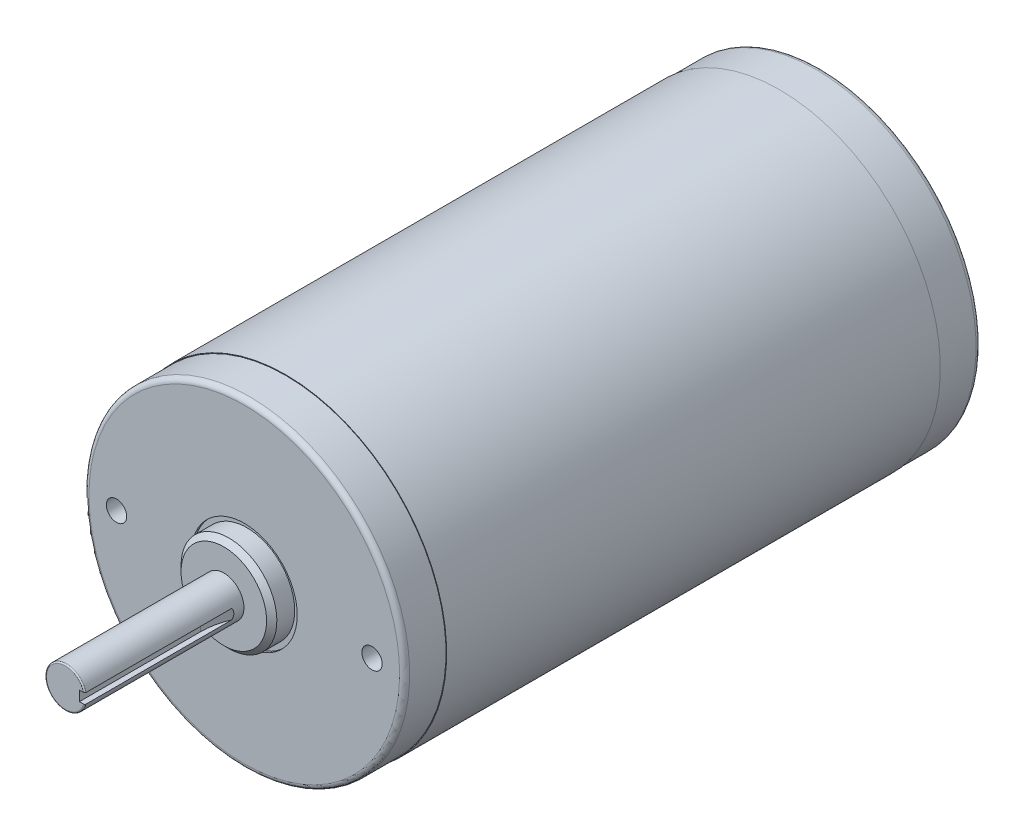
ISO-10303-21;
HEADER;
FILE_DESCRIPTION(('STEP AP214'),'2;1');
FILE_NAME('part.step','',(''),(''),'','','');
FILE_SCHEMA(('AUTOMOTIVE_DESIGN { 1 0 10303 214 1 1 1 1 }'));
ENDSEC;
DATA;
#1=APPLICATION_CONTEXT('core data for automotive mechanical design processes');
#2=APPLICATION_PROTOCOL_DEFINITION('international standard','automotive_design',2000,#1);
#3=PRODUCT_CONTEXT('',#1,'mechanical');
#4=PRODUCT('Part','Part','',(#3));
#5=PRODUCT_RELATED_PRODUCT_CATEGORY('part','',(#4));
#6=PRODUCT_DEFINITION_FORMATION('','',#4);
#7=PRODUCT_DEFINITION_CONTEXT('part definition',#1,'design');
#8=PRODUCT_DEFINITION('design','',#6,#7);
#9=PRODUCT_DEFINITION_SHAPE('','',#8);
#10=(LENGTH_UNIT() NAMED_UNIT(*) SI_UNIT(.MILLI.,.METRE.));
#11=(NAMED_UNIT(*) PLANE_ANGLE_UNIT() SI_UNIT($,.RADIAN.));
#12=(NAMED_UNIT(*) SI_UNIT($,.STERADIAN.) SOLID_ANGLE_UNIT());
#13=UNCERTAINTY_MEASURE_WITH_UNIT(LENGTH_MEASURE(1.E-05),#10,'distance_accuracy_value','');
#14=(GEOMETRIC_REPRESENTATION_CONTEXT(3) GLOBAL_UNCERTAINTY_ASSIGNED_CONTEXT((#13)) GLOBAL_UNIT_ASSIGNED_CONTEXT((#10,
#11,#12)) REPRESENTATION_CONTEXT('',''));
#15=CARTESIAN_POINT('',(0.,0.,0.));
#16=DIRECTION('',(0.,0.,1.));
#17=DIRECTION('',(1.,0.,0.));
#18=AXIS2_PLACEMENT_3D('',#15,#16,#17);
#19=CARTESIAN_POINT('',(35.56,109.2962,54.614));
#20=DIRECTION('',(0.,0.,1.));
#21=DIRECTION('',(0.,-1.,0.));
#22=AXIS2_PLACEMENT_3D('',#19,#20,#21);
#23=PLANE('',#22);
#24=DIRECTION('',(1.,0.,0.));
#25=VECTOR('',#24,1.);
#26=CARTESIAN_POINT('',(51.06,108.2962,54.614));
#27=LINE('',#26,#25);
#28=CARTESIAN_POINT('',(39.1700576172688,108.2962,54.614));
#29=VERTEX_POINT('',#28);
#30=CARTESIAN_POINT('',(38.36,108.2962,54.614));
#31=VERTEX_POINT('',#30);
#32=EDGE_CURVE('E83',#29,#31,#27,.F.);
#33=ORIENTED_EDGE('',*,*,#32,.T.);
#34=DIRECTION('',(0.,-1.,0.));
#35=VECTOR('',#34,1.);
#36=CARTESIAN_POINT('',(38.36,110.2962,54.614));
#37=LINE('',#36,#35);
#38=CARTESIAN_POINT('',(38.36,110.2962,54.614));
#39=VERTEX_POINT('',#38);
#40=EDGE_CURVE('E603',#31,#39,#37,.F.);
#41=ORIENTED_EDGE('',*,*,#40,.T.);
#42=DIRECTION('',(1.,0.,0.));
#43=VECTOR('',#42,1.);
#44=CARTESIAN_POINT('',(35.56,110.2962,54.614));
#45=LINE('',#44,#43);
#46=CARTESIAN_POINT('',(39.1700576172688,110.2962,54.614));
#47=VERTEX_POINT('',#46);
#48=EDGE_CURVE('E609',#39,#47,#45,.T.);
#49=ORIENTED_EDGE('',*,*,#48,.T.);
#50=CARTESIAN_POINT('',(35.56,109.2962,54.614));
#51=DIRECTION('',(0.,0.,-1.));
#52=DIRECTION('',(0.963709988592829,-0.266951414842494,0.));
#53=AXIS2_PLACEMENT_3D('',#50,#51,#52);
#54=CIRCLE('',#53,3.74600000000007);
#55=EDGE_CURVE('E85',#29,#47,#54,.T.);
#56=ORIENTED_EDGE('',*,*,#55,.F.);
#57=EDGE_LOOP('',(#33,#41,#49,#56));
#58=FACE_BOUND('',#57,.T.);
#59=ADVANCED_FACE('F17',(#58),#23,.T.);
#60=CARTESIAN_POINT('',(38.36,110.2962,54.614));
#61=DIRECTION('',(-1.,0.,0.));
#62=DIRECTION('',(0.,-1.,0.));
#63=AXIS2_PLACEMENT_3D('',#60,#61,#62);
#64=PLANE('',#63);
#65=DIRECTION('',(0.,1.,0.));
#66=VECTOR('',#65,1.);
#67=CARTESIAN_POINT('',(38.3600000000007,110.2962,30.5028774341236));
#68=LINE('',#67,#66);
#69=CARTESIAN_POINT('',(38.3600000000004,108.2962,30.5028774341239));
#70=VERTEX_POINT('',#69);
#71=CARTESIAN_POINT('',(38.3600000000004,110.2962,30.5028774341239));
#72=VERTEX_POINT('',#71);
#73=EDGE_CURVE('E100',#70,#72,#68,.T.);
#74=ORIENTED_EDGE('',*,*,#73,.T.);
#75=DIRECTION('',(0.,0.,1.));
#76=VECTOR('',#75,1.);
#77=CARTESIAN_POINT('',(38.36,110.2962,30.5028774341242));
#78=LINE('',#77,#76);
#79=EDGE_CURVE('E105',#39,#72,#78,.F.);
#80=ORIENTED_EDGE('',*,*,#79,.F.);
#81=ORIENTED_EDGE('',*,*,#40,.F.);
#82=DIRECTION('',(0.,0.,1.));
#83=VECTOR('',#82,1.);
#84=CARTESIAN_POINT('',(38.36,108.2962,30.5028774341234));
#85=LINE('',#84,#83);
#86=EDGE_CURVE('E606',#31,#70,#85,.F.);
#87=ORIENTED_EDGE('',*,*,#86,.T.);
#88=EDGE_LOOP('',(#74,#80,#81,#87));
#89=FACE_BOUND('',#88,.T.);
#90=ADVANCED_FACE('F588',(#89),#64,.F.);
#91=CARTESIAN_POINT('',(51.06,108.2962,30.5028774341234));
#92=DIRECTION('',(0.,-1.,0.));
#93=DIRECTION('',(1.,0.,0.));
#94=AXIS2_PLACEMENT_3D('',#91,#92,#93);
#95=PLANE('',#94);
#96=CARTESIAN_POINT('',(39.4329833462075,108.2962,54.36));
#97=CARTESIAN_POINT('',(39.4329972302194,108.2962,54.3739555925539));
#98=CARTESIAN_POINT('',(39.4317963848783,108.2962,54.387905050171));
#99=CARTESIAN_POINT('',(39.4270706819027,108.2962,54.4153819522983));
#100=CARTESIAN_POINT('',(39.4235496437534,108.2962,54.4289100521796));
#101=CARTESIAN_POINT('',(39.4142875070865,108.2962,54.4551853282689));
#102=CARTESIAN_POINT('',(39.4085459927767,108.2962,54.4679323577005));
#103=CARTESIAN_POINT('',(39.3950323448073,108.2962,54.4922988412567));
#104=CARTESIAN_POINT('',(39.3872600824922,108.2962,54.5039182238766));
#105=CARTESIAN_POINT('',(39.3698096556218,108.2962,54.5258734762801));
#106=CARTESIAN_POINT('',(39.3601078912621,108.2962,54.5361905694883));
#107=CARTESIAN_POINT('',(39.3391541322935,108.2962,54.5551089394723));
#108=CARTESIAN_POINT('',(39.3279017708629,108.2962,54.5637098090623));
#109=CARTESIAN_POINT('',(39.3038057604817,108.2962,54.5792300533628));
#110=CARTESIAN_POINT('',(39.2909241824277,108.2962,54.5860904762996));
#111=CARTESIAN_POINT('',(39.2642176606051,108.2962,54.5976268733184));
#112=CARTESIAN_POINT('',(39.2503927849253,108.2962,54.6023030048755));
#113=CARTESIAN_POINT('',(39.2254631214693,108.2962,54.6085530156468));
#114=CARTESIAN_POINT('',(39.2144729871068,108.2962,54.6105953325383));
#115=CARTESIAN_POINT('',(39.1923419471974,108.2962,54.6133188375813));
#116=CARTESIAN_POINT('',(39.1812012915638,108.2962,54.6140020556655));
#117=CARTESIAN_POINT('',(39.1700576172688,108.2962,54.614));
#118=B_SPLINE_CURVE_WITH_KNOTS('',3,(#96,#97,#98,#99,#100,#101,#102,#103,#104,#105,#106,#107,
#108,#109,#110,#111,#112,#113,#114,#115,#116,#117),.UNSPECIFIED.,.F.,.F.,(4,2,2,2,2,2,2,2,2,2,
4),(0.,0.0418059388647966,0.0835432284377074,0.125288337258225,0.167036091434435,
0.209329914368102,0.251633759901483,0.295221449388893,0.338805995964188,0.372260040088268,
0.405664080047949),.UNSPECIFIED.);
#119=CARTESIAN_POINT('',(39.4329833462075,108.2962,54.36));
#120=VERTEX_POINT('',#119);
#121=EDGE_CURVE('E75',#120,#29,#118,.T.);
#122=ORIENTED_EDGE('',*,*,#121,.F.);
#123=DIRECTION('',(0.,0.,1.));
#124=VECTOR('',#123,1.);
#125=CARTESIAN_POINT('',(39.4329833462075,108.2962,19.05));
#126=LINE('',#125,#124);
#127=CARTESIAN_POINT('',(39.4329833462075,108.2962,25.3938184471467));
#128=VERTEX_POINT('',#127);
#129=EDGE_CURVE('E79',#128,#120,#126,.T.);
#130=ORIENTED_EDGE('',*,*,#129,.F.);
#131=CARTESIAN_POINT('',(51.0600000000007,108.2962,30.5028774341242));
#132=DIRECTION('',(0.,1.,0.));
#133=DIRECTION('',(0.,0.,1.));
#134=AXIS2_PLACEMENT_3D('',#131,#132,#133);
#135=CIRCLE('',#134,12.7);
#136=EDGE_CURVE('E108',#128,#70,#135,.T.);
#137=ORIENTED_EDGE('',*,*,#136,.T.);
#138=ORIENTED_EDGE('',*,*,#86,.F.);
#139=ORIENTED_EDGE('',*,*,#32,.F.);
#140=EDGE_LOOP('',(#122,#130,#137,#138,#139));
#141=FACE_BOUND('',#140,.T.);
#142=ADVANCED_FACE('F76',(#141),#95,.F.);
#143=CARTESIAN_POINT('',(35.56,109.2962,54.36));
#144=DIRECTION('',(0.,0.,1.));
#145=DIRECTION('',(0.,-1.,0.));
#146=AXIS2_PLACEMENT_3D('',#143,#144,#145);
#147=TOROIDAL_SURFACE('',#146,3.74600000000008,0.254);
#148=CARTESIAN_POINT('',(39.4329833462075,110.2962,54.36));
#149=CARTESIAN_POINT('',(39.4329972302194,110.2962,54.3739555925539));
#150=CARTESIAN_POINT('',(39.4317963848783,110.2962,54.387905050171));
#151=CARTESIAN_POINT('',(39.4270706819027,110.2962,54.4153819522983));
#152=CARTESIAN_POINT('',(39.4235496437534,110.2962,54.4289100521796));
#153=CARTESIAN_POINT('',(39.4142875070865,110.2962,54.4551853282689));
#154=CARTESIAN_POINT('',(39.4085459927767,110.2962,54.4679323577005));
#155=CARTESIAN_POINT('',(39.3950323448073,110.2962,54.4922988412567));
#156=CARTESIAN_POINT('',(39.3872600824921,110.2962,54.5039182238766));
#157=CARTESIAN_POINT('',(39.3698096556218,110.2962,54.5258734762801));
#158=CARTESIAN_POINT('',(39.3601078912621,110.2962,54.5361905694883));
#159=CARTESIAN_POINT('',(39.3391541322935,110.2962,54.5551089394723));
#160=CARTESIAN_POINT('',(39.3279017708629,110.2962,54.5637098090622));
#161=CARTESIAN_POINT('',(39.3038057604817,110.2962,54.5792300533628));
#162=CARTESIAN_POINT('',(39.2909241824277,110.2962,54.5860904762996));
#163=CARTESIAN_POINT('',(39.2642176606051,110.2962,54.5976268733184));
#164=CARTESIAN_POINT('',(39.2503927849253,110.2962,54.6023030048755));
#165=CARTESIAN_POINT('',(39.2254631214693,110.2962,54.6085530156468));
#166=CARTESIAN_POINT('',(39.2144729871069,110.2962,54.6105953325383));
#167=CARTESIAN_POINT('',(39.1923419471974,110.2962,54.6133188375813));
#168=CARTESIAN_POINT('',(39.1812012915638,110.2962,54.6140020556655));
#169=CARTESIAN_POINT('',(39.1700576172688,110.2962,54.614));
#170=B_SPLINE_CURVE_WITH_KNOTS('',3,(#148,#149,#150,#151,#152,#153,#154,#155,#156,#157,#158,
#159,#160,#161,#162,#163,#164,#165,#166,#167,#168,#169),.UNSPECIFIED.,.F.,.F.,(4,2,2,2,2,2,2,2,
2,2,4),(0.,0.0418059388647897,0.0835432284377073,0.125288337258224,0.167036091434433,
0.2093299143681,0.251633759901491,0.295221449388889,0.33880599596417,0.37226004008825,
0.405664080047945),.UNSPECIFIED.);
#171=CARTESIAN_POINT('',(39.4329833462075,110.2962,54.36));
#172=VERTEX_POINT('',#171);
#173=EDGE_CURVE('E70',#172,#47,#170,.T.);
#174=ORIENTED_EDGE('',*,*,#173,.F.);
#175=CARTESIAN_POINT('',(35.56,109.2962,54.36));
#176=DIRECTION('',(0.,0.,1.));
#177=DIRECTION('',(0.,-1.,0.));
#178=AXIS2_PLACEMENT_3D('',#175,#176,#177);
#179=CIRCLE('',#178,4.00000000000008);
#180=EDGE_CURVE('E87',#120,#172,#179,.F.);
#181=ORIENTED_EDGE('',*,*,#180,.F.);
#182=ORIENTED_EDGE('',*,*,#121,.T.);
#183=ORIENTED_EDGE('',*,*,#55,.T.);
#184=EDGE_LOOP('',(#174,#181,#182,#183));
#185=FACE_BOUND('',#184,.T.);
#186=ADVANCED_FACE('F88',(#185),#147,.T.);
#187=CARTESIAN_POINT('',(51.0600000000007,110.2962,30.5028774341242));
#188=DIRECTION('',(0.,-1.,0.));
#189=DIRECTION('',(1.,0.,0.));
#190=AXIS2_PLACEMENT_3D('',#187,#188,#189);
#191=PLANE('',#190);
#192=ORIENTED_EDGE('',*,*,#79,.T.);
#193=CARTESIAN_POINT('',(51.0600000000007,110.2962,30.5028774341242));
#194=DIRECTION('',(0.,1.,0.));
#195=DIRECTION('',(0.,0.,1.));
#196=AXIS2_PLACEMENT_3D('',#193,#194,#195);
#197=CIRCLE('',#196,12.7);
#198=CARTESIAN_POINT('',(39.4329833462075,110.2962,25.3938184471467));
#199=VERTEX_POINT('',#198);
#200=EDGE_CURVE('E98',#72,#199,#197,.F.);
#201=ORIENTED_EDGE('',*,*,#200,.T.);
#202=DIRECTION('',(0.,0.,1.));
#203=VECTOR('',#202,1.);
#204=CARTESIAN_POINT('',(39.4329833462075,110.2962,19.05));
#205=LINE('',#204,#203);
#206=EDGE_CURVE('E91',#172,#199,#205,.F.);
#207=ORIENTED_EDGE('',*,*,#206,.F.);
#208=ORIENTED_EDGE('',*,*,#173,.T.);
#209=ORIENTED_EDGE('',*,*,#48,.F.);
#210=EDGE_LOOP('',(#192,#201,#207,#208,#209));
#211=FACE_BOUND('',#210,.T.);
#212=ADVANCED_FACE('F117',(#211),#191,.T.);
#213=CARTESIAN_POINT('',(51.0600000000007,110.2962,30.5028774341242));
#214=DIRECTION('',(0.,1.,0.));
#215=DIRECTION('',(0.,0.,1.));
#216=AXIS2_PLACEMENT_3D('',#213,#214,#215);
#217=CYLINDRICAL_SURFACE('',#216,12.7);
#218=ORIENTED_EDGE('',*,*,#200,.F.);
#219=ORIENTED_EDGE('',*,*,#73,.F.);
#220=ORIENTED_EDGE('',*,*,#136,.F.);
#221=CARTESIAN_POINT('',(39.4329833462075,110.2962,25.3938184471467));
#222=CARTESIAN_POINT('',(39.4442317520605,110.25263261094,25.3682192455707));
#223=CARTESIAN_POINT('',(39.454947982302,110.208090174955,25.3440615437786));
#224=CARTESIAN_POINT('',(39.4751334869054,110.117118948374,25.2988906850036));
#225=CARTESIAN_POINT('',(39.4846016584873,110.070688536337,25.2778803067777));
#226=CARTESIAN_POINT('',(39.5108774698462,109.928528322122,25.2199251524628));
#227=CARTESIAN_POINT('',(39.5254947717104,109.830161364369,25.1881949912346));
#228=CARTESIAN_POINT('',(39.5474896917982,109.62828616436,25.1407122573447));
#229=CARTESIAN_POINT('',(39.5548294350205,109.524753940146,25.1250432585619));
#230=CARTESIAN_POINT('',(39.5612991351951,109.316499542354,25.1112223367775));
#231=CARTESIAN_POINT('',(39.5604505001186,109.211781186261,25.1130247360236));
#232=CARTESIAN_POINT('',(39.551065803864,109.012214532221,25.1330981001397));
#233=CARTESIAN_POINT('',(39.5431036438256,108.91720956491,25.1501396976628));
#234=CARTESIAN_POINT('',(39.5210229202816,108.731340262415,25.1979090322099));
#235=CARTESIAN_POINT('',(39.506896530992,108.640481353346,25.2286541675982));
#236=CARTESIAN_POINT('',(39.481881946363,108.508226784637,25.2839126598855));
#237=CARTESIAN_POINT('',(39.4728375796526,108.464554648146,25.3040102704448));
#238=CARTESIAN_POINT('',(39.4536772761722,108.379038362948,25.3469270264641));
#239=CARTESIAN_POINT('',(39.4435658035996,108.337187558168,25.3697348805538));
#240=CARTESIAN_POINT('',(39.4329833462076,108.2962,25.3938184471466));
#241=B_SPLINE_CURVE_WITH_KNOTS('',3,(#221,#222,#223,#224,#225,#226,#227,#228,#229,#230,#231,
#232,#233,#234,#235,#236,#237,#238,#239,#240),.UNSPECIFIED.,.F.,.F.,(4,2,2,2,2,2,2,2,2,4),(0.,
0.155247486385998,0.310631242259195,0.622221027639447,0.935424056507869,1.24780845919819,
1.53706104359906,1.82668192127713,1.97333419210925,2.11939559764206),.UNSPECIFIED.);
#242=EDGE_CURVE('E97',#199,#128,#241,.T.);
#243=ORIENTED_EDGE('',*,*,#242,.F.);
#244=EDGE_LOOP('',(#218,#219,#220,#243));
#245=FACE_BOUND('',#244,.T.);
#246=ADVANCED_FACE('F195',(#245),#217,.F.);
#247=CARTESIAN_POINT('',(35.56,109.2962,19.05));
#248=DIRECTION('',(0.,0.,1.));
#249=DIRECTION('',(0.,-1.,0.));
#250=AXIS2_PLACEMENT_3D('',#247,#248,#249);
#251=CYLINDRICAL_SURFACE('',#250,4.00000000000008);
#252=ORIENTED_EDGE('',*,*,#206,.T.);
#253=ORIENTED_EDGE('',*,*,#242,.T.);
#254=ORIENTED_EDGE('',*,*,#129,.T.);
#255=ORIENTED_EDGE('',*,*,#180,.T.);
#256=EDGE_LOOP('',(#252,#253,#254,#255));
#257=FACE_BOUND('',#256,.T.);
#258=CARTESIAN_POINT('',(35.56,109.2962,23.114));
#259=DIRECTION('',(0.,0.,1.));
#260=DIRECTION('',(0.,-1.,0.));
#261=AXIS2_PLACEMENT_3D('',#258,#259,#260);
#262=CIRCLE('',#261,4.00000000000008);
#263=CARTESIAN_POINT('',(35.56,105.2962,23.114));
#264=VERTEX_POINT('',#263);
#265=EDGE_CURVE('E187',#264,#264,#262,.F.);
#266=ORIENTED_EDGE('',*,*,#265,.F.);
#267=EDGE_LOOP('',(#266));
#268=FACE_BOUND('',#267,.T.);
#269=ADVANCED_FACE('F94',(#257,#268),#251,.T.);
#270=CARTESIAN_POINT('',(39.5600000000005,109.2962,23.114));
#271=DIRECTION('',(0.,0.,1.));
#272=DIRECTION('',(0.,-1.,0.));
#273=AXIS2_PLACEMENT_3D('',#270,#271,#272);
#274=PLANE('',#273);
#275=ORIENTED_EDGE('',*,*,#265,.T.);
#276=EDGE_LOOP('',(#275));
#277=FACE_BOUND('',#276,.T.);
#278=CARTESIAN_POINT('',(35.5600000000005,109.2962,23.1139999999999));
#279=DIRECTION('',(0.,0.,-1.));
#280=DIRECTION('',(-1.,0.,0.));
#281=AXIS2_PLACEMENT_3D('',#278,#279,#280);
#282=CIRCLE('',#281,8.50900000182389);
#283=CARTESIAN_POINT('',(27.0509999981766,109.2962,23.1139999999999));
#284=VERTEX_POINT('',#283);
#285=EDGE_CURVE('E184',#284,#284,#282,.T.);
#286=ORIENTED_EDGE('',*,*,#285,.F.);
#287=EDGE_LOOP('',(#286));
#288=FACE_BOUND('',#287,.T.);
#289=ADVANCED_FACE('F200',(#277,#288),#274,.T.);
#290=CARTESIAN_POINT('',(35.5600000000005,109.2962,22.098));
#291=DIRECTION('',(0.,0.,-1.));
#292=DIRECTION('',(-1.,0.,0.));
#293=AXIS2_PLACEMENT_3D('',#290,#291,#292);
#294=CONICAL_SURFACE('',#293,9.52500000000019,0.785398162500002);
#295=ORIENTED_EDGE('',*,*,#285,.T.);
#296=EDGE_LOOP('',(#295));
#297=FACE_BOUND('',#296,.T.);
#298=CARTESIAN_POINT('',(35.56,109.2962,22.098));
#299=DIRECTION('',(0.,0.,1.));
#300=DIRECTION('',(0.,-1.,0.));
#301=AXIS2_PLACEMENT_3D('',#298,#299,#300);
#302=CIRCLE('',#301,9.52500000000018);
#303=CARTESIAN_POINT('',(35.56,99.7711999999998,22.098));
#304=VERTEX_POINT('',#303);
#305=EDGE_CURVE('E183',#304,#304,#302,.F.);
#306=ORIENTED_EDGE('',*,*,#305,.F.);
#307=EDGE_LOOP('',(#306));
#308=FACE_BOUND('',#307,.T.);
#309=ADVANCED_FACE('F203',(#297,#308),#294,.T.);
#310=CARTESIAN_POINT('',(54.1670906828555,120.503559639096,-97.8026999999982));
#311=DIRECTION('',(0.,0.,-1.));
#312=DIRECTION('',(-1.,0.,0.));
#313=AXIS2_PLACEMENT_3D('',#310,#311,#312);
#314=PLANE('',#313);
#315=CARTESIAN_POINT('',(54.1670906828555,120.503559639096,-97.8026999999315));
#316=DIRECTION('',(0.,0.,1.));
#317=DIRECTION('',(1.,0.,0.));
#318=AXIS2_PLACEMENT_3D('',#315,#316,#317);
#319=CIRCLE('',#318,2.1180000000269);
#320=CARTESIAN_POINT('',(56.2850906828824,120.503559639096,-97.8026999999315));
#321=VERTEX_POINT('',#320);
#322=EDGE_CURVE('E180',#321,#321,#319,.T.);
#323=ORIENTED_EDGE('',*,*,#322,.F.);
#324=EDGE_LOOP('',(#323));
#325=FACE_BOUND('',#324,.T.);
#326=ADVANCED_FACE('F207',(#325),#314,.T.);
#327=CARTESIAN_POINT('',(50.5968,109.2962,-100.317299999998));
#328=DIRECTION('',(0.,0.,-1.));
#329=DIRECTION('',(-1.,0.,0.));
#330=AXIS2_PLACEMENT_3D('',#327,#328,#329);
#331=PLANE('',#330);
#332=CARTESIAN_POINT('',(35.5600000000005,109.2962,-100.317299999998));
#333=DIRECTION('',(0.,0.,1.));
#334=DIRECTION('',(0.,1.,0.));
#335=AXIS2_PLACEMENT_3D('',#332,#333,#334);
#336=CIRCLE('',#335,14.0368);
#337=CARTESIAN_POINT('',(35.5600000000005,123.333,-100.317299999998));
#338=VERTEX_POINT('',#337);
#339=EDGE_CURVE('E179',#338,#338,#336,.T.);
#340=ORIENTED_EDGE('',*,*,#339,.F.);
#341=EDGE_LOOP('',(#340));
#342=FACE_BOUND('',#341,.T.);
#343=ADVANCED_FACE('F211',(#342),#331,.T.);
#344=CARTESIAN_POINT('',(46.7673596390944,127.903290682857,-97.802699999998));
#345=DIRECTION('',(0.,0.,-1.));
#346=DIRECTION('',(-1.,0.,0.));
#347=AXIS2_PLACEMENT_3D('',#344,#345,#346);
#348=PLANE('',#347);
#349=CARTESIAN_POINT('',(46.7673596390944,127.903290682857,-97.8026999999315));
#350=DIRECTION('',(0.,0.,1.));
#351=DIRECTION('',(0.,-1.,0.));
#352=AXIS2_PLACEMENT_3D('',#349,#350,#351);
#353=CIRCLE('',#352,2.11799999999929);
#354=CARTESIAN_POINT('',(46.7673596390944,125.785290682858,-97.8026999999315));
#355=VERTEX_POINT('',#354);
#356=EDGE_CURVE('E176',#355,#355,#353,.T.);
#357=ORIENTED_EDGE('',*,*,#356,.F.);
#358=EDGE_LOOP('',(#357));
#359=FACE_BOUND('',#358,.T.);
#360=ADVANCED_FACE('F216',(#359),#348,.T.);
#361=CARTESIAN_POINT('',(35.56,109.2962,19.05));
#362=DIRECTION('',(0.,0.,1.));
#363=DIRECTION('',(0.,-1.,0.));
#364=AXIS2_PLACEMENT_3D('',#361,#362,#363);
#365=CYLINDRICAL_SURFACE('',#364,9.52500000000018);
#366=ORIENTED_EDGE('',*,*,#305,.T.);
#367=EDGE_LOOP('',(#366));
#368=FACE_BOUND('',#367,.T.);
#369=CARTESIAN_POINT('',(35.56,109.2962,18.542));
#370=DIRECTION('',(0.,0.,1.));
#371=DIRECTION('',(0.,-1.,0.));
#372=AXIS2_PLACEMENT_3D('',#369,#370,#371);
#373=CIRCLE('',#372,9.52500000000018);
#374=CARTESIAN_POINT('',(35.56,99.7711999999998,18.542));
#375=VERTEX_POINT('',#374);
#376=EDGE_CURVE('E172',#375,#375,#373,.F.);
#377=ORIENTED_EDGE('',*,*,#376,.F.);
#378=EDGE_LOOP('',(#377));
#379=FACE_BOUND('',#378,.T.);
#380=ADVANCED_FACE('F260',(#368,#379),#365,.T.);
#381=CARTESIAN_POINT('',(54.1670906828555,120.503559639096,-95.60269999605));
#382=DIRECTION('',(0.,0.,1.));
#383=DIRECTION('',(1.,0.,0.));
#384=AXIS2_PLACEMENT_3D('',#381,#382,#383);
#385=CONICAL_SURFACE('',#384,4.31799999992941,0.785398162493121);
#386=ORIENTED_EDGE('',*,*,#322,.T.);
#387=EDGE_LOOP('',(#386));
#388=FACE_BOUND('',#387,.T.);
#389=CARTESIAN_POINT('',(54.1670906828555,120.503559639096,-95.6026999960494));
#390=DIRECTION('',(0.,0.,-1.));
#391=DIRECTION('',(0.,1.,0.));
#392=AXIS2_PLACEMENT_3D('',#389,#390,#391);
#393=CIRCLE('',#392,4.31800000000007);
#394=CARTESIAN_POINT('',(54.1670906828555,124.821559639096,-95.6026999960494));
#395=VERTEX_POINT('',#394);
#396=EDGE_CURVE('E175',#395,#395,#393,.F.);
#397=ORIENTED_EDGE('',*,*,#396,.F.);
#398=EDGE_LOOP('',(#397));
#399=FACE_BOUND('',#398,.T.);
#400=ADVANCED_FACE('F248',(#388,#399),#385,.T.);
#401=CARTESIAN_POINT('',(35.5600000000005,109.2962,-99.3172999999979));
#402=DIRECTION('',(0.,0.,-1.));
#403=DIRECTION('',(1.,0.,0.));
#404=AXIS2_PLACEMENT_3D('',#401,#402,#403);
#405=TOROIDAL_SURFACE('',#404,14.0368,1.);
#406=CARTESIAN_POINT('',(35.56,109.2962,-99.3172999999979));
#407=DIRECTION('',(0.,0.,1.));
#408=DIRECTION('',(0.,-1.,0.));
#409=AXIS2_PLACEMENT_3D('',#406,#407,#408);
#410=CIRCLE('',#409,15.0368000000003);
#411=CARTESIAN_POINT('',(35.56,94.2593999999997,-99.3172999999979));
#412=VERTEX_POINT('',#411);
#413=EDGE_CURVE('E382',#412,#412,#410,.T.);
#414=ORIENTED_EDGE('',*,*,#413,.F.);
#415=EDGE_LOOP('',(#414));
#416=FACE_BOUND('',#415,.T.);
#417=ORIENTED_EDGE('',*,*,#339,.T.);
#418=EDGE_LOOP('',(#417));
#419=FACE_BOUND('',#418,.T.);
#420=ADVANCED_FACE('F236',(#416,#419),#405,.T.);
#421=CARTESIAN_POINT('',(46.7673596390944,127.903290682857,-95.6026999959931));
#422=DIRECTION('',(0.,0.,1.));
#423=DIRECTION('',(0.,-1.,0.));
#424=AXIS2_PLACEMENT_3D('',#421,#422,#423);
#425=CONICAL_SURFACE('',#424,4.31799999995863,0.785398162493121);
#426=ORIENTED_EDGE('',*,*,#356,.T.);
#427=EDGE_LOOP('',(#426));
#428=FACE_BOUND('',#427,.T.);
#429=CARTESIAN_POINT('',(46.7673596390944,127.903290682857,-95.6026999960491));
#430=DIRECTION('',(0.,0.,-1.));
#431=DIRECTION('',(0.,1.,0.));
#432=AXIS2_PLACEMENT_3D('',#429,#430,#431);
#433=CIRCLE('',#432,4.31800000000007);
#434=CARTESIAN_POINT('',(46.7673596390944,132.221290682857,-95.6026999960491));
#435=VERTEX_POINT('',#434);
#436=EDGE_CURVE('E377',#435,#435,#433,.F.);
#437=ORIENTED_EDGE('',*,*,#436,.F.);
#438=EDGE_LOOP('',(#437));
#439=FACE_BOUND('',#438,.T.);
#440=ADVANCED_FACE('F247',(#428,#439),#425,.T.);
#441=CARTESIAN_POINT('',(60.96,109.296200000001,5.43559999988474));
#442=DIRECTION('',(0.,0.,1.));
#443=DIRECTION('',(1.,0.,0.));
#444=AXIS2_PLACEMENT_3D('',#441,#442,#443);
#445=CONICAL_SURFACE('',#444,2.01929999989257,1.02974425735474);
#446=CARTESIAN_POINT('',(60.9600000001365,109.296200000001,4.22228214864617));
#447=VERTEX_POINT('',#446);
#448=VERTEX_LOOP('',#447);
#449=FACE_BOUND('',#448,.T.);
#450=CARTESIAN_POINT('',(60.96,109.2962,5.43560000000074));
#451=DIRECTION('',(0.,0.,-1.));
#452=DIRECTION('',(0.,1.,0.));
#453=AXIS2_PLACEMENT_3D('',#450,#451,#452);
#454=CIRCLE('',#453,2.01930000000004);
#455=CARTESIAN_POINT('',(60.96,111.3155,5.43560000000074));
#456=VERTEX_POINT('',#455);
#457=EDGE_CURVE('E372',#456,#456,#454,.F.);
#458=ORIENTED_EDGE('',*,*,#457,.T.);
#459=EDGE_LOOP('',(#458));
#460=FACE_BOUND('',#459,.T.);
#461=ADVANCED_FACE('F280',(#449,#460),#445,.F.);
#462=CARTESIAN_POINT('',(10.1599999999995,109.2962,5.43560000005527));
#463=DIRECTION('',(0.,0.,1.));
#464=DIRECTION('',(1.,0.,0.));
#465=AXIS2_PLACEMENT_3D('',#462,#463,#464);
#466=CONICAL_SURFACE('',#465,2.01930000004369,1.02974425748063);
#467=CARTESIAN_POINT('',(10.1599999998712,109.2962,4.2222821488167));
#468=VERTEX_POINT('',#467);
#469=VERTEX_LOOP('',#468);
#470=FACE_BOUND('',#469,.T.);
#471=CARTESIAN_POINT('',(10.1599999999994,109.2962,5.43560000000069));
#472=DIRECTION('',(0.,0.,-1.));
#473=DIRECTION('',(0.,1.,0.));
#474=AXIS2_PLACEMENT_3D('',#471,#472,#473);
#475=CIRCLE('',#474,2.01930000000004);
#476=CARTESIAN_POINT('',(10.1599999999994,111.3155,5.43560000000069));
#477=VERTEX_POINT('',#476);
#478=EDGE_CURVE('E171',#477,#477,#475,.F.);
#479=ORIENTED_EDGE('',*,*,#478,.T.);
#480=EDGE_LOOP('',(#479));
#481=FACE_BOUND('',#480,.T.);
#482=ADVANCED_FACE('F269',(#470,#481),#466,.F.);
#483=CARTESIAN_POINT('',(46.0883,109.2962,18.542));
#484=DIRECTION('',(0.,0.,1.));
#485=DIRECTION('',(0.,-1.,0.));
#486=AXIS2_PLACEMENT_3D('',#483,#484,#485);
#487=PLANE('',#486);
#488=CARTESIAN_POINT('',(35.56,109.2962,18.542));
#489=DIRECTION('',(0.,0.,1.));
#490=DIRECTION('',(0.,-1.,0.));
#491=AXIS2_PLACEMENT_3D('',#488,#489,#490);
#492=CIRCLE('',#491,10.5283000000002);
#493=CARTESIAN_POINT('',(35.56,98.7678999999998,18.542));
#494=VERTEX_POINT('',#493);
#495=EDGE_CURVE('E168',#494,#494,#492,.T.);
#496=ORIENTED_EDGE('',*,*,#495,.T.);
#497=EDGE_LOOP('',(#496));
#498=FACE_BOUND('',#497,.T.);
#499=ORIENTED_EDGE('',*,*,#376,.T.);
#500=EDGE_LOOP('',(#499));
#501=FACE_BOUND('',#500,.T.);
#502=ADVANCED_FACE('F266',(#498,#501),#487,.T.);
#503=CARTESIAN_POINT('',(54.1670906828555,120.503559639096,-97.8026999999982));
#504=DIRECTION('',(0.,0.,-1.));
#505=DIRECTION('',(0.,1.,0.));
#506=AXIS2_PLACEMENT_3D('',#503,#504,#505);
#507=CYLINDRICAL_SURFACE('',#506,4.31800000000007);
#508=ORIENTED_EDGE('',*,*,#396,.T.);
#509=EDGE_LOOP('',(#508));
#510=FACE_BOUND('',#509,.T.);
#511=CARTESIAN_POINT('',(54.1670906828555,120.503559639096,-95.554799999998));
#512=DIRECTION('',(0.,0.,-1.));
#513=DIRECTION('',(0.,1.,0.));
#514=AXIS2_PLACEMENT_3D('',#511,#512,#513);
#515=CIRCLE('',#514,4.31800000000007);
#516=CARTESIAN_POINT('',(54.1670906828555,124.821559639096,-95.554799999998));
#517=VERTEX_POINT('',#516);
#518=EDGE_CURVE('E165',#517,#517,#515,.F.);
#519=ORIENTED_EDGE('',*,*,#518,.F.);
#520=EDGE_LOOP('',(#519));
#521=FACE_BOUND('',#520,.T.);
#522=ADVANCED_FACE('F268',(#510,#521),#507,.T.);
#523=CARTESIAN_POINT('',(35.56,109.2962,19.05));
#524=DIRECTION('',(0.,0.,1.));
#525=DIRECTION('',(0.,-1.,0.));
#526=AXIS2_PLACEMENT_3D('',#523,#524,#525);
#527=CYLINDRICAL_SURFACE('',#526,15.0368000000003);
#528=CARTESIAN_POINT('',(35.56,109.2962,-95.554799999998));
#529=DIRECTION('',(0.,0.,1.));
#530=DIRECTION('',(0.,-1.,0.));
#531=AXIS2_PLACEMENT_3D('',#528,#529,#530);
#532=CIRCLE('',#531,15.0368000000003);
#533=CARTESIAN_POINT('',(35.56,94.2593999999997,-95.554799999998));
#534=VERTEX_POINT('',#533);
#535=EDGE_CURVE('E162',#534,#534,#532,.T.);
#536=ORIENTED_EDGE('',*,*,#535,.F.);
#537=EDGE_LOOP('',(#536));
#538=FACE_BOUND('',#537,.T.);
#539=ORIENTED_EDGE('',*,*,#413,.T.);
#540=EDGE_LOOP('',(#539));
#541=FACE_BOUND('',#540,.T.);
#542=ADVANCED_FACE('F277',(#538,#541),#527,.T.);
#543=CARTESIAN_POINT('',(46.7673596390944,127.903290682857,-97.802699999998));
#544=DIRECTION('',(0.,0.,-1.));
#545=DIRECTION('',(0.,1.,0.));
#546=AXIS2_PLACEMENT_3D('',#543,#544,#545);
#547=CYLINDRICAL_SURFACE('',#546,4.31800000000007);
#548=ORIENTED_EDGE('',*,*,#436,.T.);
#549=EDGE_LOOP('',(#548));
#550=FACE_BOUND('',#549,.T.);
#551=CARTESIAN_POINT('',(46.7673596390944,127.903290682857,-95.554799999998));
#552=DIRECTION('',(0.,0.,-1.));
#553=DIRECTION('',(0.,1.,0.));
#554=AXIS2_PLACEMENT_3D('',#551,#552,#553);
#555=CIRCLE('',#554,4.31800000000007);
#556=CARTESIAN_POINT('',(46.7673596390944,132.221290682857,-95.554799999998));
#557=VERTEX_POINT('',#556);
#558=EDGE_CURVE('E159',#557,#557,#555,.F.);
#559=ORIENTED_EDGE('',*,*,#558,.F.);
#560=EDGE_LOOP('',(#559));
#561=FACE_BOUND('',#560,.T.);
#562=ADVANCED_FACE('F438',(#550,#561),#547,.T.);
#563=CARTESIAN_POINT('',(60.96,109.2962,19.0500000000008));
#564=DIRECTION('',(0.,0.,-1.));
#565=DIRECTION('',(0.,1.,0.));
#566=AXIS2_PLACEMENT_3D('',#563,#564,#565);
#567=CYLINDRICAL_SURFACE('',#566,2.01930000000004);
#568=ORIENTED_EDGE('',*,*,#457,.F.);
#569=EDGE_LOOP('',(#568));
#570=FACE_BOUND('',#569,.T.);
#571=CARTESIAN_POINT('',(60.96,109.2962,19.05));
#572=DIRECTION('',(0.,0.,-1.));
#573=DIRECTION('',(0.,1.,0.));
#574=AXIS2_PLACEMENT_3D('',#571,#572,#573);
#575=CIRCLE('',#574,2.01930000000004);
#576=CARTESIAN_POINT('',(60.96,111.3155,19.05));
#577=VERTEX_POINT('',#576);
#578=EDGE_CURVE('E156',#577,#577,#575,.T.);
#579=ORIENTED_EDGE('',*,*,#578,.F.);
#580=EDGE_LOOP('',(#579));
#581=FACE_BOUND('',#580,.T.);
#582=ADVANCED_FACE('F446',(#570,#581),#567,.F.);
#583=CARTESIAN_POINT('',(10.1599999999994,109.2962,19.0500000000007));
#584=DIRECTION('',(0.,0.,-1.));
#585=DIRECTION('',(0.,1.,0.));
#586=AXIS2_PLACEMENT_3D('',#583,#584,#585);
#587=CYLINDRICAL_SURFACE('',#586,2.01930000000004);
#588=ORIENTED_EDGE('',*,*,#478,.F.);
#589=EDGE_LOOP('',(#588));
#590=FACE_BOUND('',#589,.T.);
#591=CARTESIAN_POINT('',(10.1599999999994,109.2962,19.05));
#592=DIRECTION('',(0.,0.,-1.));
#593=DIRECTION('',(0.,1.,0.));
#594=AXIS2_PLACEMENT_3D('',#591,#592,#593);
#595=CIRCLE('',#594,2.01930000000004);
#596=CARTESIAN_POINT('',(10.1599999999994,111.3155,19.05));
#597=VERTEX_POINT('',#596);
#598=EDGE_CURVE('E153',#597,#597,#595,.T.);
#599=ORIENTED_EDGE('',*,*,#598,.F.);
#600=EDGE_LOOP('',(#599));
#601=FACE_BOUND('',#600,.T.);
#602=ADVANCED_FACE('F454',(#590,#601),#587,.F.);
#603=CARTESIAN_POINT('',(35.56,109.2962,19.05));
#604=DIRECTION('',(0.,0.,1.));
#605=DIRECTION('',(0.,-1.,0.));
#606=AXIS2_PLACEMENT_3D('',#603,#604,#605);
#607=CYLINDRICAL_SURFACE('',#606,10.5283000000002);
#608=CARTESIAN_POINT('',(35.56,109.2962,19.05));
#609=DIRECTION('',(0.,0.,1.));
#610=DIRECTION('',(0.,-1.,0.));
#611=AXIS2_PLACEMENT_3D('',#608,#609,#610);
#612=CIRCLE('',#611,10.5283000000002);
#613=CARTESIAN_POINT('',(35.56,98.7678999999998,19.05));
#614=VERTEX_POINT('',#613);
#615=EDGE_CURVE('E149',#614,#614,#612,.F.);
#616=ORIENTED_EDGE('',*,*,#615,.F.);
#617=EDGE_LOOP('',(#616));
#618=FACE_BOUND('',#617,.T.);
#619=ORIENTED_EDGE('',*,*,#495,.F.);
#620=EDGE_LOOP('',(#619));
#621=FACE_BOUND('',#620,.T.);
#622=ADVANCED_FACE('F345',(#618,#621),#607,.F.);
#623=CARTESIAN_POINT('',(67.4370000000013,109.2962,-95.554799999998));
#624=DIRECTION('',(0.,0.,-1.));
#625=DIRECTION('',(-1.,0.,0.));
#626=AXIS2_PLACEMENT_3D('',#623,#624,#625);
#627=PLANE('',#626);
#628=ORIENTED_EDGE('',*,*,#558,.T.);
#629=EDGE_LOOP('',(#628));
#630=FACE_BOUND('',#629,.T.);
#631=ORIENTED_EDGE('',*,*,#535,.T.);
#632=EDGE_LOOP('',(#631));
#633=FACE_BOUND('',#632,.T.);
#634=CARTESIAN_POINT('',(35.56,109.2962,-95.5547999999979));
#635=DIRECTION('',(0.,0.,1.));
#636=DIRECTION('',(0.,1.,0.));
#637=AXIS2_PLACEMENT_3D('',#634,#635,#636);
#638=CIRCLE('',#637,30.877);
#639=CARTESIAN_POINT('',(35.56,140.1732,-95.5547999999979));
#640=VERTEX_POINT('',#639);
#641=EDGE_CURVE('E152',#640,#640,#638,.T.);
#642=ORIENTED_EDGE('',*,*,#641,.F.);
#643=EDGE_LOOP('',(#642));
#644=FACE_BOUND('',#643,.T.);
#645=ORIENTED_EDGE('',*,*,#518,.T.);
#646=EDGE_LOOP('',(#645));
#647=FACE_BOUND('',#646,.T.);
#648=ADVANCED_FACE('F340',(#630,#633,#644,#647),#627,.T.);
#649=CARTESIAN_POINT('',(46.0883,109.2962,19.05));
#650=DIRECTION('',(0.,0.,1.));
#651=DIRECTION('',(0.,-1.,0.));
#652=AXIS2_PLACEMENT_3D('',#649,#650,#651);
#653=PLANE('',#652);
#654=ORIENTED_EDGE('',*,*,#615,.T.);
#655=EDGE_LOOP('',(#654));
#656=FACE_BOUND('',#655,.T.);
#657=CARTESIAN_POINT('',(35.56,109.2962,19.05));
#658=DIRECTION('',(0.,0.,-1.));
#659=DIRECTION('',(0.,-1.,0.));
#660=AXIS2_PLACEMENT_3D('',#657,#658,#659);
#661=CIRCLE('',#660,30.8770000000005);
#662=CARTESIAN_POINT('',(35.56,78.4191999999995,19.05));
#663=VERTEX_POINT('',#662);
#664=EDGE_CURVE('E327',#663,#663,#661,.T.);
#665=ORIENTED_EDGE('',*,*,#664,.F.);
#666=EDGE_LOOP('',(#665));
#667=FACE_BOUND('',#666,.T.);
#668=ORIENTED_EDGE('',*,*,#598,.T.);
#669=EDGE_LOOP('',(#668));
#670=FACE_BOUND('',#669,.T.);
#671=ORIENTED_EDGE('',*,*,#578,.T.);
#672=EDGE_LOOP('',(#671));
#673=FACE_BOUND('',#672,.T.);
#674=ADVANCED_FACE('F331',(#656,#667,#670,#673),#653,.T.);
#675=CARTESIAN_POINT('',(35.56,109.2962,-94.5547999999979));
#676=DIRECTION('',(0.,0.,-1.));
#677=DIRECTION('',(1.,0.,0.));
#678=AXIS2_PLACEMENT_3D('',#675,#676,#677);
#679=TOROIDAL_SURFACE('',#678,30.877,1.);
#680=CARTESIAN_POINT('',(35.56,109.2962,-94.5547999999979));
#681=DIRECTION('',(0.,0.,1.));
#682=DIRECTION('',(0.,-1.,0.));
#683=AXIS2_PLACEMENT_3D('',#680,#681,#682);
#684=CIRCLE('',#683,31.8770000000005);
#685=CARTESIAN_POINT('',(35.56,77.4191999999995,-94.5547999999979));
#686=VERTEX_POINT('',#685);
#687=EDGE_CURVE('E507',#686,#686,#684,.T.);
#688=ORIENTED_EDGE('',*,*,#687,.F.);
#689=EDGE_LOOP('',(#688));
#690=FACE_BOUND('',#689,.T.);
#691=ORIENTED_EDGE('',*,*,#641,.T.);
#692=EDGE_LOOP('',(#691));
#693=FACE_BOUND('',#692,.T.);
#694=ADVANCED_FACE('F311',(#690,#693),#679,.T.);
#695=CARTESIAN_POINT('',(35.56,109.2962,18.05));
#696=DIRECTION('',(0.,0.,1.));
#697=DIRECTION('',(-1.,0.,0.));
#698=AXIS2_PLACEMENT_3D('',#695,#696,#697);
#699=TOROIDAL_SURFACE('',#698,30.877,1.);
#700=CARTESIAN_POINT('',(35.56,109.2962,18.05));
#701=DIRECTION('',(0.,0.,1.));
#702=DIRECTION('',(0.,-1.,0.));
#703=AXIS2_PLACEMENT_3D('',#700,#701,#702);
#704=CIRCLE('',#703,31.8770000000005);
#705=CARTESIAN_POINT('',(35.56,77.4191999999995,18.05));
#706=VERTEX_POINT('',#705);
#707=EDGE_CURVE('E148',#706,#706,#704,.F.);
#708=ORIENTED_EDGE('',*,*,#707,.F.);
#709=EDGE_LOOP('',(#708));
#710=FACE_BOUND('',#709,.T.);
#711=ORIENTED_EDGE('',*,*,#664,.T.);
#712=EDGE_LOOP('',(#711));
#713=FACE_BOUND('',#712,.T.);
#714=ADVANCED_FACE('F305',(#710,#713),#699,.T.);
#715=CARTESIAN_POINT('',(35.56,109.2962,19.05));
#716=DIRECTION('',(0.,0.,1.));
#717=DIRECTION('',(0.,-1.,0.));
#718=AXIS2_PLACEMENT_3D('',#715,#716,#717);
#719=CYLINDRICAL_SURFACE('',#718,31.8770000000005);
#720=CARTESIAN_POINT('',(35.56,109.2962,-87.325199999998));
#721=DIRECTION('',(0.,0.,1.));
#722=DIRECTION('',(0.,-1.,0.));
#723=AXIS2_PLACEMENT_3D('',#720,#721,#722);
#724=CIRCLE('',#723,31.8770000000005);
#725=CARTESIAN_POINT('',(35.56,77.4191999999995,-87.325199999998));
#726=VERTEX_POINT('',#725);
#727=EDGE_CURVE('E145',#726,#726,#724,.T.);
#728=ORIENTED_EDGE('',*,*,#727,.F.);
#729=EDGE_LOOP('',(#728));
#730=FACE_BOUND('',#729,.T.);
#731=ORIENTED_EDGE('',*,*,#687,.T.);
#732=EDGE_LOOP('',(#731));
#733=FACE_BOUND('',#732,.T.);
#734=ADVANCED_FACE('F301',(#730,#733),#719,.T.);
#735=CARTESIAN_POINT('',(35.56,109.2962,19.05));
#736=DIRECTION('',(0.,0.,1.));
#737=DIRECTION('',(0.,-1.,0.));
#738=AXIS2_PLACEMENT_3D('',#735,#736,#737);
#739=CYLINDRICAL_SURFACE('',#738,31.8770000000005);
#740=ORIENTED_EDGE('',*,*,#707,.T.);
#741=EDGE_LOOP('',(#740));
#742=FACE_BOUND('',#741,.T.);
#743=CARTESIAN_POINT('',(35.56,109.2962,10.8204000000007));
#744=DIRECTION('',(0.,0.,1.));
#745=DIRECTION('',(0.,-1.,0.));
#746=AXIS2_PLACEMENT_3D('',#743,#744,#745);
#747=CIRCLE('',#746,31.8770000000005);
#748=CARTESIAN_POINT('',(35.56,77.4191999999995,10.8204000000007));
#749=VERTEX_POINT('',#748);
#750=EDGE_CURVE('E142',#749,#749,#747,.F.);
#751=ORIENTED_EDGE('',*,*,#750,.F.);
#752=EDGE_LOOP('',(#751));
#753=FACE_BOUND('',#752,.T.);
#754=ADVANCED_FACE('F297',(#742,#753),#739,.T.);
#755=CARTESIAN_POINT('',(67.5640000000008,109.296200000001,-87.325199999998));
#756=DIRECTION('',(0.,0.,-1.));
#757=DIRECTION('',(-1.,0.,0.));
#758=AXIS2_PLACEMENT_3D('',#755,#756,#757);
#759=PLANE('',#758);
#760=ORIENTED_EDGE('',*,*,#727,.T.);
#761=EDGE_LOOP('',(#760));
#762=FACE_BOUND('',#761,.T.);
#763=CARTESIAN_POINT('',(35.56,109.2962,-87.325199999998));
#764=DIRECTION('',(0.,0.,1.));
#765=DIRECTION('',(0.,-1.,0.));
#766=AXIS2_PLACEMENT_3D('',#763,#764,#765);
#767=CIRCLE('',#766,32.0040000000005);
#768=CARTESIAN_POINT('',(35.56,77.2921999999995,-87.325199999998));
#769=VERTEX_POINT('',#768);
#770=EDGE_CURVE('E32',#769,#769,#767,.T.);
#771=ORIENTED_EDGE('',*,*,#770,.F.);
#772=EDGE_LOOP('',(#771));
#773=FACE_BOUND('',#772,.T.);
#774=ADVANCED_FACE('F290',(#762,#773),#759,.T.);
#775=CARTESIAN_POINT('',(67.437,109.296200000002,10.8204000000007));
#776=DIRECTION('',(0.,0.,1.));
#777=DIRECTION('',(0.,-1.,0.));
#778=AXIS2_PLACEMENT_3D('',#775,#776,#777);
#779=PLANE('',#778);
#780=CARTESIAN_POINT('',(35.56,109.2962,10.8204000000007));
#781=DIRECTION('',(0.,0.,1.));
#782=DIRECTION('',(0.,-1.,0.));
#783=AXIS2_PLACEMENT_3D('',#780,#781,#782);
#784=CIRCLE('',#783,32.0040000000005);
#785=CARTESIAN_POINT('',(35.56,77.2921999999995,10.8204000000007));
#786=VERTEX_POINT('',#785);
#787=EDGE_CURVE('E11',#786,#786,#784,.F.);
#788=ORIENTED_EDGE('',*,*,#787,.F.);
#789=EDGE_LOOP('',(#788));
#790=FACE_BOUND('',#789,.T.);
#791=ORIENTED_EDGE('',*,*,#750,.T.);
#792=EDGE_LOOP('',(#791));
#793=FACE_BOUND('',#792,.T.);
#794=ADVANCED_FACE('F284',(#790,#793),#779,.T.);
#795=CARTESIAN_POINT('',(35.56,109.2962,19.05));
#796=DIRECTION('',(0.,0.,1.));
#797=DIRECTION('',(0.,-1.,0.));
#798=AXIS2_PLACEMENT_3D('',#795,#796,#797);
#799=CYLINDRICAL_SURFACE('',#798,32.0040000000005);
#800=ORIENTED_EDGE('',*,*,#787,.T.);
#801=EDGE_LOOP('',(#800));
#802=FACE_BOUND('',#801,.T.);
#803=ORIENTED_EDGE('',*,*,#770,.T.);
#804=EDGE_LOOP('',(#803));
#805=FACE_BOUND('',#804,.T.);
#806=ADVANCED_FACE('F282',(#802,#805),#799,.T.);
#807=CLOSED_SHELL('',(#59,#90,#142,#186,#212,#246,#269,#289,#309,#326,#343,#360,#380,#400,#420,
#440,#461,#482,#502,#522,#542,#562,#582,#602,#622,#648,#674,#694,#714,#734,#754,#774,#794,#806));
#808=MANIFOLD_SOLID_BREP('B1',#807);
#809=ADVANCED_BREP_SHAPE_REPRESENTATION('',(#18,#808),#14);
#810=SHAPE_DEFINITION_REPRESENTATION(#9,#809);
ENDSEC;
END-ISO-10303-21;
